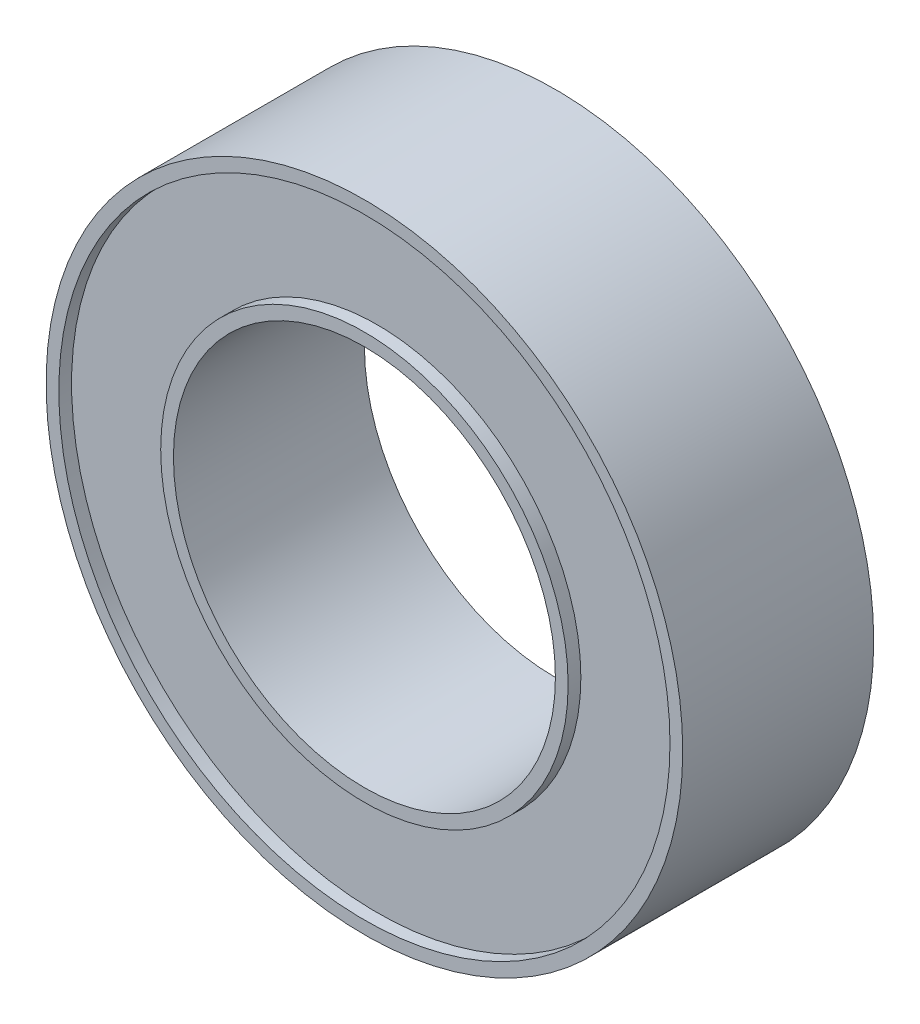
ISO-10303-21;
HEADER;
FILE_DESCRIPTION(('STEP AP214'),'2;1');
FILE_NAME('part.step','',(''),(''),'','','');
FILE_SCHEMA(('AUTOMOTIVE_DESIGN { 1 0 10303 214 1 1 1 1 }'));
ENDSEC;
DATA;
#1=APPLICATION_CONTEXT('core data for automotive mechanical design processes');
#2=APPLICATION_PROTOCOL_DEFINITION('international standard','automotive_design',2000,#1);
#3=PRODUCT_CONTEXT('',#1,'mechanical');
#4=PRODUCT('Part','Part','',(#3));
#5=PRODUCT_RELATED_PRODUCT_CATEGORY('part','',(#4));
#6=PRODUCT_DEFINITION_FORMATION('','',#4);
#7=PRODUCT_DEFINITION_CONTEXT('part definition',#1,'design');
#8=PRODUCT_DEFINITION('design','',#6,#7);
#9=PRODUCT_DEFINITION_SHAPE('','',#8);
#10=(LENGTH_UNIT() NAMED_UNIT(*) SI_UNIT(.MILLI.,.METRE.));
#11=(NAMED_UNIT(*) PLANE_ANGLE_UNIT() SI_UNIT($,.RADIAN.));
#12=(NAMED_UNIT(*) SI_UNIT($,.STERADIAN.) SOLID_ANGLE_UNIT());
#13=UNCERTAINTY_MEASURE_WITH_UNIT(LENGTH_MEASURE(1.E-05),#10,'distance_accuracy_value','');
#14=(GEOMETRIC_REPRESENTATION_CONTEXT(3) GLOBAL_UNCERTAINTY_ASSIGNED_CONTEXT((#13)) GLOBAL_UNIT_ASSIGNED_CONTEXT((#10,
#11,#12)) REPRESENTATION_CONTEXT('',''));
#15=CARTESIAN_POINT('',(0.,0.,0.));
#16=DIRECTION('',(0.,0.,1.));
#17=DIRECTION('',(1.,0.,0.));
#18=AXIS2_PLACEMENT_3D('',#15,#16,#17);
#19=CARTESIAN_POINT('',(0.,0.,-1.5));
#20=DIRECTION('',(0.,0.,1.));
#21=DIRECTION('',(1.,0.,0.));
#22=AXIS2_PLACEMENT_3D('',#19,#20,#21);
#23=PLANE('',#22);
#24=CARTESIAN_POINT('',(0.,0.,-1.5));
#25=DIRECTION('',(0.,0.,1.));
#26=DIRECTION('',(1.,0.,0.));
#27=AXIS2_PLACEMENT_3D('',#24,#25,#26);
#28=CIRCLE('',#27,3.);
#29=CARTESIAN_POINT('',(3.,0.,-1.5));
#30=VERTEX_POINT('',#29);
#31=EDGE_CURVE('E45',#30,#30,#28,.T.);
#32=ORIENTED_EDGE('',*,*,#31,.T.);
#33=EDGE_LOOP('',(#32));
#34=FACE_BOUND('',#33,.T.);
#35=CARTESIAN_POINT('',(0.,0.,-1.5));
#36=DIRECTION('',(0.,0.,1.));
#37=DIRECTION('',(1.,0.,0.));
#38=AXIS2_PLACEMENT_3D('',#35,#36,#37);
#39=CIRCLE('',#38,3.2);
#40=CARTESIAN_POINT('',(3.2,0.,-1.5));
#41=VERTEX_POINT('',#40);
#42=EDGE_CURVE('E86',#41,#41,#39,.T.);
#43=ORIENTED_EDGE('',*,*,#42,.F.);
#44=EDGE_LOOP('',(#43));
#45=FACE_BOUND('',#44,.T.);
#46=ADVANCED_FACE('F37',(#34,#45),#23,.F.);
#47=CARTESIAN_POINT('',(0.,0.,1.5));
#48=DIRECTION('',(0.,0.,1.));
#49=DIRECTION('',(1.,0.,0.));
#50=AXIS2_PLACEMENT_3D('',#47,#48,#49);
#51=PLANE('',#50);
#52=CARTESIAN_POINT('',(0.,0.,1.5));
#53=DIRECTION('',(0.,0.,1.));
#54=DIRECTION('',(1.,0.,0.));
#55=AXIS2_PLACEMENT_3D('',#52,#53,#54);
#56=CIRCLE('',#55,3.);
#57=CARTESIAN_POINT('',(3.,0.,1.5));
#58=VERTEX_POINT('',#57);
#59=EDGE_CURVE('E55',#58,#58,#56,.T.);
#60=ORIENTED_EDGE('',*,*,#59,.F.);
#61=EDGE_LOOP('',(#60));
#62=FACE_BOUND('',#61,.T.);
#63=CARTESIAN_POINT('',(0.,0.,1.5));
#64=DIRECTION('',(0.,0.,1.));
#65=DIRECTION('',(1.,0.,0.));
#66=AXIS2_PLACEMENT_3D('',#63,#64,#65);
#67=CIRCLE('',#66,3.2);
#68=CARTESIAN_POINT('',(3.2,0.,1.5));
#69=VERTEX_POINT('',#68);
#70=EDGE_CURVE('E70',#69,#69,#67,.T.);
#71=ORIENTED_EDGE('',*,*,#70,.T.);
#72=EDGE_LOOP('',(#71));
#73=FACE_BOUND('',#72,.T.);
#74=ADVANCED_FACE('F104',(#62,#73),#51,.T.);
#75=CARTESIAN_POINT('',(0.,0.,-1.5));
#76=DIRECTION('',(0.,0.,1.));
#77=DIRECTION('',(1.,0.,0.));
#78=AXIS2_PLACEMENT_3D('',#75,#76,#77);
#79=CYLINDRICAL_SURFACE('',#78,5.);
#80=CARTESIAN_POINT('',(0.,0.,-1.5));
#81=DIRECTION('',(0.,0.,1.));
#82=DIRECTION('',(1.,0.,0.));
#83=AXIS2_PLACEMENT_3D('',#80,#81,#82);
#84=CIRCLE('',#83,5.);
#85=CARTESIAN_POINT('',(5.,0.,-1.5));
#86=VERTEX_POINT('',#85);
#87=EDGE_CURVE('E10',#86,#86,#84,.T.);
#88=ORIENTED_EDGE('',*,*,#87,.T.);
#89=EDGE_LOOP('',(#88));
#90=FACE_BOUND('',#89,.T.);
#91=CARTESIAN_POINT('',(0.,0.,1.5));
#92=DIRECTION('',(0.,0.,1.));
#93=DIRECTION('',(1.,0.,0.));
#94=AXIS2_PLACEMENT_3D('',#91,#92,#93);
#95=CIRCLE('',#94,5.);
#96=CARTESIAN_POINT('',(5.,0.,1.5));
#97=VERTEX_POINT('',#96);
#98=EDGE_CURVE('E50',#97,#97,#95,.T.);
#99=ORIENTED_EDGE('',*,*,#98,.F.);
#100=EDGE_LOOP('',(#99));
#101=FACE_BOUND('',#100,.T.);
#102=ADVANCED_FACE('F39',(#90,#101),#79,.T.);
#103=CARTESIAN_POINT('',(0.,0.,-1.5));
#104=DIRECTION('',(0.,0.,1.));
#105=DIRECTION('',(1.,0.,0.));
#106=AXIS2_PLACEMENT_3D('',#103,#104,#105);
#107=CIRCLE('',#106,4.8);
#108=CARTESIAN_POINT('',(4.8,0.,-1.5));
#109=VERTEX_POINT('',#108);
#110=EDGE_CURVE('E78',#109,#109,#107,.T.);
#111=ORIENTED_EDGE('',*,*,#110,.T.);
#112=EDGE_LOOP('',(#111));
#113=FACE_BOUND('',#112,.T.);
#114=ORIENTED_EDGE('',*,*,#87,.F.);
#115=EDGE_LOOP('',(#114));
#116=FACE_BOUND('',#115,.T.);
#117=ADVANCED_FACE('F105',(#113,#116),#23,.F.);
#118=CARTESIAN_POINT('',(0.,0.,-1.5));
#119=DIRECTION('',(0.,0.,1.));
#120=DIRECTION('',(1.,0.,0.));
#121=AXIS2_PLACEMENT_3D('',#118,#119,#120);
#122=CYLINDRICAL_SURFACE('',#121,3.);
#123=ORIENTED_EDGE('',*,*,#31,.F.);
#124=EDGE_LOOP('',(#123));
#125=FACE_BOUND('',#124,.T.);
#126=ORIENTED_EDGE('',*,*,#59,.T.);
#127=EDGE_LOOP('',(#126));
#128=FACE_BOUND('',#127,.T.);
#129=ADVANCED_FACE('F114',(#125,#128),#122,.F.);
#130=CARTESIAN_POINT('',(0.,0.,1.5));
#131=DIRECTION('',(0.,0.,1.));
#132=DIRECTION('',(1.,0.,0.));
#133=AXIS2_PLACEMENT_3D('',#130,#131,#132);
#134=CIRCLE('',#133,4.8);
#135=CARTESIAN_POINT('',(4.8,0.,1.5));
#136=VERTEX_POINT('',#135);
#137=EDGE_CURVE('E62',#136,#136,#134,.T.);
#138=ORIENTED_EDGE('',*,*,#137,.F.);
#139=EDGE_LOOP('',(#138));
#140=FACE_BOUND('',#139,.T.);
#141=ORIENTED_EDGE('',*,*,#98,.T.);
#142=EDGE_LOOP('',(#141));
#143=FACE_BOUND('',#142,.T.);
#144=ADVANCED_FACE('F111',(#140,#143),#51,.T.);
#145=CARTESIAN_POINT('',(0.,0.,1.3));
#146=DIRECTION('',(0.,0.,1.));
#147=DIRECTION('',(1.,0.,0.));
#148=AXIS2_PLACEMENT_3D('',#145,#146,#147);
#149=CYLINDRICAL_SURFACE('',#148,4.8);
#150=CARTESIAN_POINT('',(0.,0.,1.3));
#151=DIRECTION('',(0.,0.,1.));
#152=DIRECTION('',(1.,0.,0.));
#153=AXIS2_PLACEMENT_3D('',#150,#151,#152);
#154=CIRCLE('',#153,4.8);
#155=CARTESIAN_POINT('',(4.8,0.,1.3));
#156=VERTEX_POINT('',#155);
#157=EDGE_CURVE('E61',#156,#156,#154,.T.);
#158=ORIENTED_EDGE('',*,*,#157,.F.);
#159=EDGE_LOOP('',(#158));
#160=FACE_BOUND('',#159,.T.);
#161=ORIENTED_EDGE('',*,*,#137,.T.);
#162=EDGE_LOOP('',(#161));
#163=FACE_BOUND('',#162,.T.);
#164=ADVANCED_FACE('F140',(#160,#163),#149,.F.);
#165=CARTESIAN_POINT('',(0.,0.,1.3));
#166=DIRECTION('',(0.,0.,1.));
#167=DIRECTION('',(1.,0.,0.));
#168=AXIS2_PLACEMENT_3D('',#165,#166,#167);
#169=PLANE('',#168);
#170=CARTESIAN_POINT('',(0.,0.,1.3));
#171=DIRECTION('',(0.,0.,1.));
#172=DIRECTION('',(1.,0.,0.));
#173=AXIS2_PLACEMENT_3D('',#170,#171,#172);
#174=CIRCLE('',#173,3.2);
#175=CARTESIAN_POINT('',(3.2,0.,1.3));
#176=VERTEX_POINT('',#175);
#177=EDGE_CURVE('E66',#176,#176,#174,.T.);
#178=ORIENTED_EDGE('',*,*,#177,.F.);
#179=EDGE_LOOP('',(#178));
#180=FACE_BOUND('',#179,.T.);
#181=ORIENTED_EDGE('',*,*,#157,.T.);
#182=EDGE_LOOP('',(#181));
#183=FACE_BOUND('',#182,.T.);
#184=ADVANCED_FACE('F136',(#180,#183),#169,.T.);
#185=CARTESIAN_POINT('',(0.,0.,1.3));
#186=DIRECTION('',(0.,0.,1.));
#187=DIRECTION('',(1.,0.,0.));
#188=AXIS2_PLACEMENT_3D('',#185,#186,#187);
#189=CYLINDRICAL_SURFACE('',#188,3.2);
#190=ORIENTED_EDGE('',*,*,#177,.T.);
#191=EDGE_LOOP('',(#190));
#192=FACE_BOUND('',#191,.T.);
#193=ORIENTED_EDGE('',*,*,#70,.F.);
#194=EDGE_LOOP('',(#193));
#195=FACE_BOUND('',#194,.T.);
#196=ADVANCED_FACE('F130',(#192,#195),#189,.T.);
#197=CARTESIAN_POINT('',(0.,0.,-1.3));
#198=DIRECTION('',(0.,0.,-1.));
#199=DIRECTION('',(1.,0.,0.));
#200=AXIS2_PLACEMENT_3D('',#197,#198,#199);
#201=PLANE('',#200);
#202=CARTESIAN_POINT('',(0.,0.,-1.3));
#203=DIRECTION('',(0.,0.,1.));
#204=DIRECTION('',(1.,0.,0.));
#205=AXIS2_PLACEMENT_3D('',#202,#203,#204);
#206=CIRCLE('',#205,4.8);
#207=CARTESIAN_POINT('',(4.8,0.,-1.3));
#208=VERTEX_POINT('',#207);
#209=EDGE_CURVE('E74',#208,#208,#206,.T.);
#210=ORIENTED_EDGE('',*,*,#209,.F.);
#211=EDGE_LOOP('',(#210));
#212=FACE_BOUND('',#211,.T.);
#213=CARTESIAN_POINT('',(0.,0.,-1.3));
#214=DIRECTION('',(0.,0.,1.));
#215=DIRECTION('',(1.,0.,0.));
#216=AXIS2_PLACEMENT_3D('',#213,#214,#215);
#217=CIRCLE('',#216,3.2);
#218=CARTESIAN_POINT('',(3.2,0.,-1.3));
#219=VERTEX_POINT('',#218);
#220=EDGE_CURVE('E82',#219,#219,#217,.T.);
#221=ORIENTED_EDGE('',*,*,#220,.T.);
#222=EDGE_LOOP('',(#221));
#223=FACE_BOUND('',#222,.T.);
#224=ADVANCED_FACE('F94',(#212,#223),#201,.T.);
#225=CARTESIAN_POINT('',(0.,0.,-1.3));
#226=DIRECTION('',(0.,0.,-1.));
#227=DIRECTION('',(-1.,0.,0.));
#228=AXIS2_PLACEMENT_3D('',#225,#226,#227);
#229=CYLINDRICAL_SURFACE('',#228,4.8);
#230=ORIENTED_EDGE('',*,*,#209,.T.);
#231=EDGE_LOOP('',(#230));
#232=FACE_BOUND('',#231,.T.);
#233=ORIENTED_EDGE('',*,*,#110,.F.);
#234=EDGE_LOOP('',(#233));
#235=FACE_BOUND('',#234,.T.);
#236=ADVANCED_FACE('F99',(#232,#235),#229,.F.);
#237=CARTESIAN_POINT('',(0.,0.,-1.3));
#238=DIRECTION('',(0.,0.,-1.));
#239=DIRECTION('',(-1.,0.,0.));
#240=AXIS2_PLACEMENT_3D('',#237,#238,#239);
#241=CYLINDRICAL_SURFACE('',#240,3.2);
#242=ORIENTED_EDGE('',*,*,#220,.F.);
#243=EDGE_LOOP('',(#242));
#244=FACE_BOUND('',#243,.T.);
#245=ORIENTED_EDGE('',*,*,#42,.T.);
#246=EDGE_LOOP('',(#245));
#247=FACE_BOUND('',#246,.T.);
#248=ADVANCED_FACE('F96',(#244,#247),#241,.T.);
#249=CLOSED_SHELL('',(#46,#74,#102,#117,#129,#144,#164,#184,#196,#224,#236,#248));
#250=MANIFOLD_SOLID_BREP('B2',#249);
#251=ADVANCED_BREP_SHAPE_REPRESENTATION('',(#18,#250),#14);
#252=SHAPE_DEFINITION_REPRESENTATION(#9,#251);
ENDSEC;
END-ISO-10303-21;
